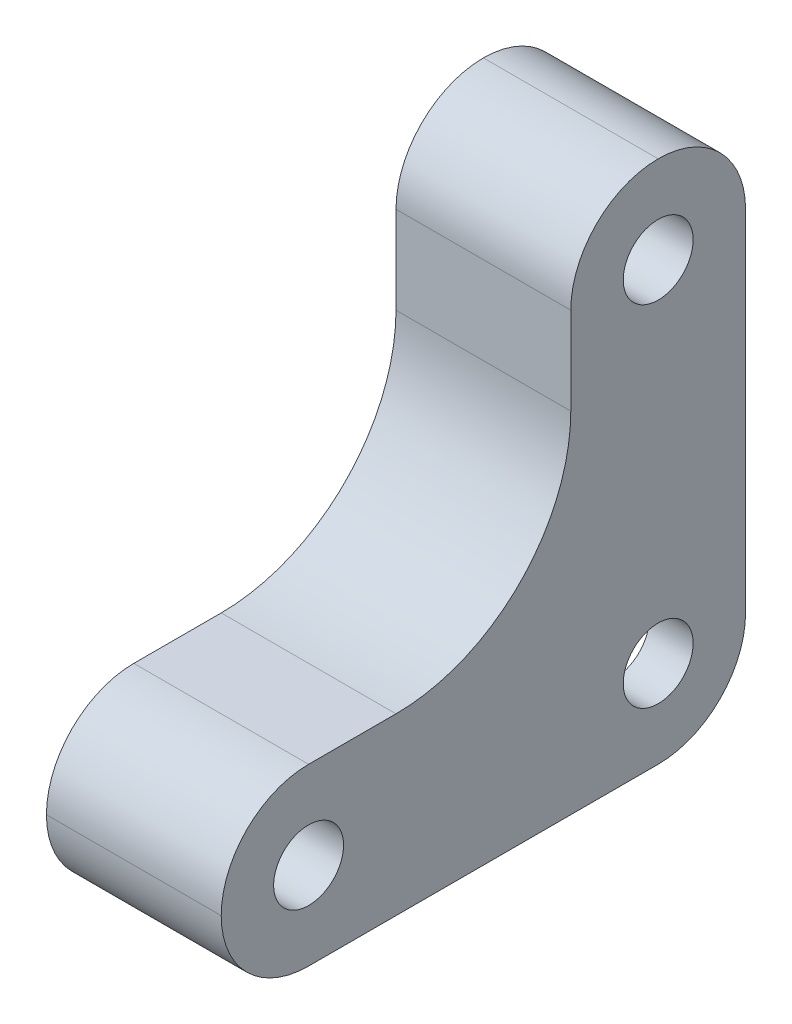
ISO-10303-21;
HEADER;
FILE_DESCRIPTION(('STEP AP214'),'2;1');
FILE_NAME('part.step','',(''),(''),'','','');
FILE_SCHEMA(('AUTOMOTIVE_DESIGN { 1 0 10303 214 1 1 1 1 }'));
ENDSEC;
DATA;
#1=APPLICATION_CONTEXT('core data for automotive mechanical design processes');
#2=APPLICATION_PROTOCOL_DEFINITION('international standard','automotive_design',2000,#1);
#3=PRODUCT_CONTEXT('',#1,'mechanical');
#4=PRODUCT('Part','Part','',(#3));
#5=PRODUCT_RELATED_PRODUCT_CATEGORY('part','',(#4));
#6=PRODUCT_DEFINITION_FORMATION('','',#4);
#7=PRODUCT_DEFINITION_CONTEXT('part definition',#1,'design');
#8=PRODUCT_DEFINITION('design','',#6,#7);
#9=PRODUCT_DEFINITION_SHAPE('','',#8);
#10=(LENGTH_UNIT() NAMED_UNIT(*) SI_UNIT(.MILLI.,.METRE.));
#11=(NAMED_UNIT(*) PLANE_ANGLE_UNIT() SI_UNIT($,.RADIAN.));
#12=(NAMED_UNIT(*) SI_UNIT($,.STERADIAN.) SOLID_ANGLE_UNIT());
#13=UNCERTAINTY_MEASURE_WITH_UNIT(LENGTH_MEASURE(1.E-05),#10,'distance_accuracy_value','');
#14=(GEOMETRIC_REPRESENTATION_CONTEXT(3) GLOBAL_UNCERTAINTY_ASSIGNED_CONTEXT((#13)) GLOBAL_UNIT_ASSIGNED_CONTEXT((#10,
#11,#12)) REPRESENTATION_CONTEXT('',''));
#15=CARTESIAN_POINT('',(0.,0.,0.));
#16=DIRECTION('',(0.,0.,1.));
#17=DIRECTION('',(1.,0.,0.));
#18=AXIS2_PLACEMENT_3D('',#15,#16,#17);
#19=CARTESIAN_POINT('',(0.,10.,0.));
#20=DIRECTION('',(0.,-1.,0.));
#21=DIRECTION('',(0.,0.,-1.));
#22=AXIS2_PLACEMENT_3D('',#19,#20,#21);
#23=PLANE('',#22);
#24=DIRECTION('',(0.,0.,-1.));
#25=VECTOR('',#24,1.);
#26=CARTESIAN_POINT('',(5.,10.,15.));
#27=LINE('',#26,#25);
#28=CARTESIAN_POINT('',(5.,10.,10.));
#29=VERTEX_POINT('',#28);
#30=CARTESIAN_POINT('',(5.,10.,5.));
#31=VERTEX_POINT('',#30);
#32=EDGE_CURVE('E212',#29,#31,#27,.T.);
#33=ORIENTED_EDGE('',*,*,#32,.T.);
#34=DIRECTION('',(1.,0.,0.));
#35=VECTOR('',#34,1.);
#36=CARTESIAN_POINT('',(-5.,10.,5.));
#37=LINE('',#36,#35);
#38=CARTESIAN_POINT('',(-5.,10.,5.));
#39=VERTEX_POINT('',#38);
#40=EDGE_CURVE('E261',#31,#39,#37,.F.);
#41=ORIENTED_EDGE('',*,*,#40,.T.);
#42=DIRECTION('',(0.,0.,1.));
#43=VECTOR('',#42,1.);
#44=CARTESIAN_POINT('',(-5.,10.,15.));
#45=LINE('',#44,#43);
#46=CARTESIAN_POINT('',(-5.,10.,10.));
#47=VERTEX_POINT('',#46);
#48=EDGE_CURVE('E216',#39,#47,#45,.T.);
#49=ORIENTED_EDGE('',*,*,#48,.T.);
#50=DIRECTION('',(1.,0.,0.));
#51=VECTOR('',#50,1.);
#52=CARTESIAN_POINT('',(0.,10.,10.));
#53=LINE('',#52,#51);
#54=EDGE_CURVE('E249',#47,#29,#53,.T.);
#55=ORIENTED_EDGE('',*,*,#54,.T.);
#56=EDGE_LOOP('',(#33,#41,#49,#55));
#57=FACE_BOUND('',#56,.T.);
#58=ADVANCED_FACE('F33',(#57),#23,.F.);
#59=CARTESIAN_POINT('',(5.,10.,15.));
#60=DIRECTION('',(-1.,0.,0.));
#61=DIRECTION('',(0.,0.,1.));
#62=AXIS2_PLACEMENT_3D('',#59,#60,#61);
#63=PLANE('',#62);
#64=CARTESIAN_POINT('',(5.,5.,-10.));
#65=DIRECTION('',(1.,0.,0.));
#66=DIRECTION('',(0.,0.,-1.));
#67=AXIS2_PLACEMENT_3D('',#64,#65,#66);
#68=CIRCLE('',#67,2.);
#69=CARTESIAN_POINT('',(5.,5.,-12.));
#70=VERTEX_POINT('',#69);
#71=EDGE_CURVE('E518',#70,#70,#68,.T.);
#72=ORIENTED_EDGE('',*,*,#71,.F.);
#73=EDGE_LOOP('',(#72));
#74=FACE_BOUND('',#73,.T.);
#75=CARTESIAN_POINT('',(5.,5.,10.));
#76=DIRECTION('',(1.,0.,0.));
#77=DIRECTION('',(0.,0.,-1.));
#78=AXIS2_PLACEMENT_3D('',#75,#76,#77);
#79=CIRCLE('',#78,2.);
#80=CARTESIAN_POINT('',(5.,5.,8.));
#81=VERTEX_POINT('',#80);
#82=EDGE_CURVE('E274',#81,#81,#79,.T.);
#83=ORIENTED_EDGE('',*,*,#82,.F.);
#84=EDGE_LOOP('',(#83));
#85=FACE_BOUND('',#84,.T.);
#86=CARTESIAN_POINT('',(5.,25.,-10.));
#87=DIRECTION('',(1.,0.,0.));
#88=DIRECTION('',(0.,0.,-1.));
#89=AXIS2_PLACEMENT_3D('',#86,#87,#88);
#90=CIRCLE('',#89,2.);
#91=CARTESIAN_POINT('',(5.,25.,-12.));
#92=VERTEX_POINT('',#91);
#93=EDGE_CURVE('E255',#92,#92,#90,.T.);
#94=ORIENTED_EDGE('',*,*,#93,.F.);
#95=EDGE_LOOP('',(#94));
#96=FACE_BOUND('',#95,.T.);
#97=DIRECTION('',(0.,0.,-1.));
#98=VECTOR('',#97,1.);
#99=CARTESIAN_POINT('',(5.,0.,15.));
#100=LINE('',#99,#98);
#101=CARTESIAN_POINT('',(5.,0.,10.));
#102=VERTEX_POINT('',#101);
#103=CARTESIAN_POINT('',(5.,0.,-10.));
#104=VERTEX_POINT('',#103);
#105=EDGE_CURVE('E213',#102,#104,#100,.T.);
#106=ORIENTED_EDGE('',*,*,#105,.T.);
#107=CARTESIAN_POINT('',(5.,5.,-10.));
#108=DIRECTION('',(-1.,0.,0.));
#109=DIRECTION('',(0.,0.,1.));
#110=AXIS2_PLACEMENT_3D('',#107,#108,#109);
#111=CIRCLE('',#110,5.);
#112=CARTESIAN_POINT('',(5.,5.,-15.));
#113=VERTEX_POINT('',#112);
#114=EDGE_CURVE('E11',#104,#113,#111,.F.);
#115=ORIENTED_EDGE('',*,*,#114,.T.);
#116=DIRECTION('',(0.,-1.,0.));
#117=VECTOR('',#116,1.);
#118=CARTESIAN_POINT('',(5.,10.,-15.));
#119=LINE('',#118,#117);
#120=CARTESIAN_POINT('',(5.,25.,-15.));
#121=VERTEX_POINT('',#120);
#122=EDGE_CURVE('E223',#121,#113,#119,.T.);
#123=ORIENTED_EDGE('',*,*,#122,.F.);
#124=CARTESIAN_POINT('',(5.,25.,-10.));
#125=DIRECTION('',(-1.,0.,0.));
#126=DIRECTION('',(0.,0.,1.));
#127=AXIS2_PLACEMENT_3D('',#124,#125,#126);
#128=CIRCLE('',#127,5.);
#129=CARTESIAN_POINT('',(5.,30.,-10.));
#130=VERTEX_POINT('',#129);
#131=EDGE_CURVE('E244',#121,#130,#128,.F.);
#132=ORIENTED_EDGE('',*,*,#131,.T.);
#133=CARTESIAN_POINT('',(5.,25.,-10.));
#134=DIRECTION('',(-1.,0.,0.));
#135=DIRECTION('',(0.,0.,1.));
#136=AXIS2_PLACEMENT_3D('',#133,#134,#135);
#137=CIRCLE('',#136,5.);
#138=CARTESIAN_POINT('',(5.,25.,-5.));
#139=VERTEX_POINT('',#138);
#140=EDGE_CURVE('E242',#130,#139,#137,.F.);
#141=ORIENTED_EDGE('',*,*,#140,.T.);
#142=DIRECTION('',(0.,-1.,0.));
#143=VECTOR('',#142,1.);
#144=CARTESIAN_POINT('',(5.,30.,-5.));
#145=LINE('',#144,#143);
#146=CARTESIAN_POINT('',(5.,20.,-5.));
#147=VERTEX_POINT('',#146);
#148=EDGE_CURVE('E273',#139,#147,#145,.T.);
#149=ORIENTED_EDGE('',*,*,#148,.T.);
#150=CARTESIAN_POINT('',(5.,20.,5.));
#151=DIRECTION('',(-1.,0.,0.));
#152=DIRECTION('',(0.,0.,1.));
#153=AXIS2_PLACEMENT_3D('',#150,#151,#152);
#154=CIRCLE('',#153,10.);
#155=EDGE_CURVE('E263',#147,#31,#154,.T.);
#156=ORIENTED_EDGE('',*,*,#155,.T.);
#157=ORIENTED_EDGE('',*,*,#32,.F.);
#158=CARTESIAN_POINT('',(5.,5.,10.));
#159=DIRECTION('',(-1.,0.,0.));
#160=DIRECTION('',(0.,0.,1.));
#161=AXIS2_PLACEMENT_3D('',#158,#159,#160);
#162=CIRCLE('',#161,5.);
#163=CARTESIAN_POINT('',(5.,5.,15.));
#164=VERTEX_POINT('',#163);
#165=EDGE_CURVE('E238',#29,#164,#162,.F.);
#166=ORIENTED_EDGE('',*,*,#165,.T.);
#167=CARTESIAN_POINT('',(5.,5.,10.));
#168=DIRECTION('',(-1.,0.,0.));
#169=DIRECTION('',(0.,0.,1.));
#170=AXIS2_PLACEMENT_3D('',#167,#168,#169);
#171=CIRCLE('',#170,5.);
#172=EDGE_CURVE('E240',#164,#102,#171,.F.);
#173=ORIENTED_EDGE('',*,*,#172,.T.);
#174=EDGE_LOOP('',(#106,#115,#123,#132,#141,#149,#156,#157,#166,#173));
#175=FACE_BOUND('',#174,.T.);
#176=ADVANCED_FACE('F298',(#74,#85,#96,#175),#63,.F.);
#177=CARTESIAN_POINT('',(-5.,10.,-15.));
#178=DIRECTION('',(0.,0.,1.));
#179=DIRECTION('',(1.,0.,0.));
#180=AXIS2_PLACEMENT_3D('',#177,#178,#179);
#181=PLANE('',#180);
#182=DIRECTION('',(0.,1.,0.));
#183=VECTOR('',#182,1.);
#184=CARTESIAN_POINT('',(-2.5,0.,-15.));
#185=LINE('',#184,#183);
#186=CARTESIAN_POINT('',(-2.5,5.,-15.));
#187=VERTEX_POINT('',#186);
#188=CARTESIAN_POINT('',(-2.5,20.,-15.));
#189=VERTEX_POINT('',#188);
#190=EDGE_CURVE('E147',#187,#189,#185,.T.);
#191=ORIENTED_EDGE('',*,*,#190,.F.);
#192=DIRECTION('',(-1.,0.,0.));
#193=VECTOR('',#192,1.);
#194=CARTESIAN_POINT('',(-5.,5.,-15.));
#195=LINE('',#194,#193);
#196=CARTESIAN_POINT('',(-5.,5.,-15.));
#197=VERTEX_POINT('',#196);
#198=EDGE_CURVE('E181',#187,#197,#195,.T.);
#199=ORIENTED_EDGE('',*,*,#198,.T.);
#200=DIRECTION('',(0.,-1.,0.));
#201=VECTOR('',#200,1.);
#202=CARTESIAN_POINT('',(-5.,10.,-15.));
#203=LINE('',#202,#201);
#204=CARTESIAN_POINT('',(-5.,25.,-15.));
#205=VERTEX_POINT('',#204);
#206=EDGE_CURVE('E207',#205,#197,#203,.T.);
#207=ORIENTED_EDGE('',*,*,#206,.F.);
#208=DIRECTION('',(-1.,0.,0.));
#209=VECTOR('',#208,1.);
#210=CARTESIAN_POINT('',(5.,25.,-15.));
#211=LINE('',#210,#209);
#212=EDGE_CURVE('E235',#205,#121,#211,.F.);
#213=ORIENTED_EDGE('',*,*,#212,.T.);
#214=ORIENTED_EDGE('',*,*,#122,.T.);
#215=DIRECTION('',(-1.,0.,0.));
#216=VECTOR('',#215,1.);
#217=CARTESIAN_POINT('',(2.5,5.,-15.));
#218=LINE('',#217,#216);
#219=CARTESIAN_POINT('',(2.5,5.,-15.));
#220=VERTEX_POINT('',#219);
#221=EDGE_CURVE('E151',#113,#220,#218,.T.);
#222=ORIENTED_EDGE('',*,*,#221,.T.);
#223=DIRECTION('',(0.,-1.,0.));
#224=VECTOR('',#223,1.);
#225=CARTESIAN_POINT('',(2.5,0.,-15.));
#226=LINE('',#225,#224);
#227=CARTESIAN_POINT('',(2.5,20.,-15.));
#228=VERTEX_POINT('',#227);
#229=EDGE_CURVE('E161',#228,#220,#226,.T.);
#230=ORIENTED_EDGE('',*,*,#229,.F.);
#231=DIRECTION('',(-1.,0.,0.));
#232=VECTOR('',#231,1.);
#233=CARTESIAN_POINT('',(-5.,20.,-15.));
#234=LINE('',#233,#232);
#235=EDGE_CURVE('E168',#228,#189,#234,.T.);
#236=ORIENTED_EDGE('',*,*,#235,.T.);
#237=EDGE_LOOP('',(#191,#199,#207,#213,#214,#222,#230,#236));
#238=FACE_BOUND('',#237,.T.);
#239=ADVANCED_FACE('F196',(#238),#181,.F.);
#240=CARTESIAN_POINT('',(-5.,10.,15.));
#241=DIRECTION('',(1.,0.,0.));
#242=DIRECTION('',(0.,0.,-1.));
#243=AXIS2_PLACEMENT_3D('',#240,#241,#242);
#244=PLANE('',#243);
#245=CARTESIAN_POINT('',(-5.,5.,-10.));
#246=DIRECTION('',(1.,0.,0.));
#247=DIRECTION('',(0.,0.,-1.));
#248=AXIS2_PLACEMENT_3D('',#245,#246,#247);
#249=CIRCLE('',#248,2.);
#250=CARTESIAN_POINT('',(-5.,5.,-12.));
#251=VERTEX_POINT('',#250);
#252=EDGE_CURVE('E178',#251,#251,#249,.T.);
#253=ORIENTED_EDGE('',*,*,#252,.T.);
#254=EDGE_LOOP('',(#253));
#255=FACE_BOUND('',#254,.T.);
#256=CARTESIAN_POINT('',(-5.,5.,10.));
#257=DIRECTION('',(1.,0.,0.));
#258=DIRECTION('',(0.,0.,-1.));
#259=AXIS2_PLACEMENT_3D('',#256,#257,#258);
#260=CIRCLE('',#259,2.);
#261=CARTESIAN_POINT('',(-5.,5.,8.));
#262=VERTEX_POINT('',#261);
#263=EDGE_CURVE('E270',#262,#262,#260,.T.);
#264=ORIENTED_EDGE('',*,*,#263,.T.);
#265=EDGE_LOOP('',(#264));
#266=FACE_BOUND('',#265,.T.);
#267=CARTESIAN_POINT('',(-5.,25.,-10.));
#268=DIRECTION('',(1.,0.,0.));
#269=DIRECTION('',(0.,0.,-1.));
#270=AXIS2_PLACEMENT_3D('',#267,#268,#269);
#271=CIRCLE('',#270,2.);
#272=CARTESIAN_POINT('',(-5.,25.,-12.));
#273=VERTEX_POINT('',#272);
#274=EDGE_CURVE('E277',#273,#273,#271,.T.);
#275=ORIENTED_EDGE('',*,*,#274,.T.);
#276=EDGE_LOOP('',(#275));
#277=FACE_BOUND('',#276,.T.);
#278=ORIENTED_EDGE('',*,*,#206,.T.);
#279=CARTESIAN_POINT('',(-5.,5.,-10.));
#280=DIRECTION('',(1.,0.,0.));
#281=DIRECTION('',(0.,0.,-1.));
#282=AXIS2_PLACEMENT_3D('',#279,#280,#281);
#283=CIRCLE('',#282,5.);
#284=CARTESIAN_POINT('',(-5.,0.,-10.));
#285=VERTEX_POINT('',#284);
#286=EDGE_CURVE('E184',#197,#285,#283,.F.);
#287=ORIENTED_EDGE('',*,*,#286,.T.);
#288=DIRECTION('',(0.,0.,1.));
#289=VECTOR('',#288,1.);
#290=CARTESIAN_POINT('',(-5.,0.,15.));
#291=LINE('',#290,#289);
#292=CARTESIAN_POINT('',(-5.,0.,10.));
#293=VERTEX_POINT('',#292);
#294=EDGE_CURVE('E205',#285,#293,#291,.T.);
#295=ORIENTED_EDGE('',*,*,#294,.T.);
#296=CARTESIAN_POINT('',(-5.,5.,10.));
#297=DIRECTION('',(1.,0.,0.));
#298=DIRECTION('',(0.,0.,-1.));
#299=AXIS2_PLACEMENT_3D('',#296,#297,#298);
#300=CIRCLE('',#299,5.);
#301=CARTESIAN_POINT('',(-5.,5.,15.));
#302=VERTEX_POINT('',#301);
#303=EDGE_CURVE('E229',#293,#302,#300,.F.);
#304=ORIENTED_EDGE('',*,*,#303,.T.);
#305=CARTESIAN_POINT('',(-5.,5.,10.));
#306=DIRECTION('',(1.,0.,0.));
#307=DIRECTION('',(0.,0.,-1.));
#308=AXIS2_PLACEMENT_3D('',#305,#306,#307);
#309=CIRCLE('',#308,5.);
#310=EDGE_CURVE('E226',#302,#47,#309,.F.);
#311=ORIENTED_EDGE('',*,*,#310,.T.);
#312=ORIENTED_EDGE('',*,*,#48,.F.);
#313=CARTESIAN_POINT('',(-5.,20.,5.));
#314=DIRECTION('',(1.,0.,0.));
#315=DIRECTION('',(0.,0.,-1.));
#316=AXIS2_PLACEMENT_3D('',#313,#314,#315);
#317=CIRCLE('',#316,10.);
#318=CARTESIAN_POINT('',(-5.,20.,-5.));
#319=VERTEX_POINT('',#318);
#320=EDGE_CURVE('E265',#39,#319,#317,.T.);
#321=ORIENTED_EDGE('',*,*,#320,.T.);
#322=DIRECTION('',(0.,-1.,0.));
#323=VECTOR('',#322,1.);
#324=CARTESIAN_POINT('',(-5.,30.,-5.));
#325=LINE('',#324,#323);
#326=CARTESIAN_POINT('',(-5.,25.,-5.));
#327=VERTEX_POINT('',#326);
#328=EDGE_CURVE('E218',#327,#319,#325,.T.);
#329=ORIENTED_EDGE('',*,*,#328,.F.);
#330=CARTESIAN_POINT('',(-5.,25.,-10.));
#331=DIRECTION('',(1.,0.,0.));
#332=DIRECTION('',(0.,0.,-1.));
#333=AXIS2_PLACEMENT_3D('',#330,#331,#332);
#334=CIRCLE('',#333,5.);
#335=CARTESIAN_POINT('',(-5.,30.,-10.));
#336=VERTEX_POINT('',#335);
#337=EDGE_CURVE('E231',#327,#336,#334,.F.);
#338=ORIENTED_EDGE('',*,*,#337,.T.);
#339=CARTESIAN_POINT('',(-5.,25.,-10.));
#340=DIRECTION('',(1.,0.,0.));
#341=DIRECTION('',(0.,0.,-1.));
#342=AXIS2_PLACEMENT_3D('',#339,#340,#341);
#343=CIRCLE('',#342,5.);
#344=EDGE_CURVE('E233',#336,#205,#343,.F.);
#345=ORIENTED_EDGE('',*,*,#344,.T.);
#346=EDGE_LOOP('',(#278,#287,#295,#304,#311,#312,#321,#329,#338,#345));
#347=FACE_BOUND('',#346,.T.);
#348=ADVANCED_FACE('F204',(#255,#266,#277,#347),#244,.F.);
#349=CARTESIAN_POINT('',(0.,0.,0.));
#350=DIRECTION('',(0.,-1.,0.));
#351=DIRECTION('',(0.,0.,-1.));
#352=AXIS2_PLACEMENT_3D('',#349,#350,#351);
#353=PLANE('',#352);
#354=ORIENTED_EDGE('',*,*,#294,.F.);
#355=DIRECTION('',(-1.,0.,0.));
#356=VECTOR('',#355,1.);
#357=CARTESIAN_POINT('',(-2.5,0.,-10.));
#358=LINE('',#357,#356);
#359=CARTESIAN_POINT('',(-2.5,0.,-10.));
#360=VERTEX_POINT('',#359);
#361=EDGE_CURVE('E187',#285,#360,#358,.F.);
#362=ORIENTED_EDGE('',*,*,#361,.T.);
#363=DIRECTION('',(0.,0.,-1.));
#364=VECTOR('',#363,1.);
#365=CARTESIAN_POINT('',(-2.5,0.,-5.));
#366=LINE('',#365,#364);
#367=CARTESIAN_POINT('',(-2.5,0.,5.00000000000004));
#368=VERTEX_POINT('',#367);
#369=EDGE_CURVE('E191',#368,#360,#366,.T.);
#370=ORIENTED_EDGE('',*,*,#369,.F.);
#371=DIRECTION('',(1.,0.,0.));
#372=VECTOR('',#371,1.);
#373=CARTESIAN_POINT('',(2.5,0.,5.00000000000004));
#374=LINE('',#373,#372);
#375=CARTESIAN_POINT('',(2.5,0.,5.00000000000004));
#376=VERTEX_POINT('',#375);
#377=EDGE_CURVE('E166',#368,#376,#374,.T.);
#378=ORIENTED_EDGE('',*,*,#377,.T.);
#379=DIRECTION('',(0.,0.,-1.));
#380=VECTOR('',#379,1.);
#381=CARTESIAN_POINT('',(2.5,0.,-5.));
#382=LINE('',#381,#380);
#383=CARTESIAN_POINT('',(2.5,0.,-10.));
#384=VERTEX_POINT('',#383);
#385=EDGE_CURVE('E199',#376,#384,#382,.T.);
#386=ORIENTED_EDGE('',*,*,#385,.T.);
#387=DIRECTION('',(-1.,0.,0.));
#388=VECTOR('',#387,1.);
#389=CARTESIAN_POINT('',(5.,0.,-10.));
#390=LINE('',#389,#388);
#391=EDGE_CURVE('E48',#384,#104,#390,.F.);
#392=ORIENTED_EDGE('',*,*,#391,.T.);
#393=ORIENTED_EDGE('',*,*,#105,.F.);
#394=DIRECTION('',(1.,0.,0.));
#395=VECTOR('',#394,1.);
#396=CARTESIAN_POINT('',(-5.,0.,10.));
#397=LINE('',#396,#395);
#398=EDGE_CURVE('E211',#102,#293,#397,.F.);
#399=ORIENTED_EDGE('',*,*,#398,.T.);
#400=EDGE_LOOP('',(#354,#362,#370,#378,#386,#392,#393,#399));
#401=FACE_BOUND('',#400,.T.);
#402=ADVANCED_FACE('F209',(#401),#353,.T.);
#403=CARTESIAN_POINT('',(-5.,30.,-5.));
#404=DIRECTION('',(0.,0.,-1.));
#405=DIRECTION('',(-1.,0.,0.));
#406=AXIS2_PLACEMENT_3D('',#403,#404,#405);
#407=PLANE('',#406);
#408=ORIENTED_EDGE('',*,*,#328,.T.);
#409=DIRECTION('',(1.,0.,0.));
#410=VECTOR('',#409,1.);
#411=CARTESIAN_POINT('',(5.,20.,-5.));
#412=LINE('',#411,#410);
#413=EDGE_CURVE('E251',#319,#147,#412,.T.);
#414=ORIENTED_EDGE('',*,*,#413,.T.);
#415=ORIENTED_EDGE('',*,*,#148,.F.);
#416=DIRECTION('',(1.,0.,0.));
#417=VECTOR('',#416,1.);
#418=CARTESIAN_POINT('',(-5.,25.,-5.));
#419=LINE('',#418,#417);
#420=EDGE_CURVE('E246',#139,#327,#419,.F.);
#421=ORIENTED_EDGE('',*,*,#420,.T.);
#422=EDGE_LOOP('',(#408,#414,#415,#421));
#423=FACE_BOUND('',#422,.T.);
#424=ADVANCED_FACE('F305',(#423),#407,.F.);
#425=CARTESIAN_POINT('',(-5.,25.,-10.));
#426=DIRECTION('',(1.,0.,0.));
#427=DIRECTION('',(0.,0.,-1.));
#428=AXIS2_PLACEMENT_3D('',#425,#426,#427);
#429=CYLINDRICAL_SURFACE('',#428,2.);
#430=ORIENTED_EDGE('',*,*,#274,.F.);
#431=EDGE_LOOP('',(#430));
#432=FACE_BOUND('',#431,.T.);
#433=ORIENTED_EDGE('',*,*,#93,.T.);
#434=EDGE_LOOP('',(#433));
#435=FACE_BOUND('',#434,.T.);
#436=ADVANCED_FACE('F373',(#432,#435),#429,.F.);
#437=CARTESIAN_POINT('',(-5.,5.,10.));
#438=DIRECTION('',(1.,0.,0.));
#439=DIRECTION('',(0.,0.,-1.));
#440=AXIS2_PLACEMENT_3D('',#437,#438,#439);
#441=CYLINDRICAL_SURFACE('',#440,2.);
#442=ORIENTED_EDGE('',*,*,#263,.F.);
#443=EDGE_LOOP('',(#442));
#444=FACE_BOUND('',#443,.T.);
#445=ORIENTED_EDGE('',*,*,#82,.T.);
#446=EDGE_LOOP('',(#445));
#447=FACE_BOUND('',#446,.T.);
#448=ADVANCED_FACE('F346',(#444,#447),#441,.F.);
#449=CARTESIAN_POINT('',(0.,25.,-10.));
#450=DIRECTION('',(-1.,0.,0.));
#451=DIRECTION('',(0.,0.,1.));
#452=AXIS2_PLACEMENT_3D('',#449,#450,#451);
#453=CYLINDRICAL_SURFACE('',#452,5.);
#454=ORIENTED_EDGE('',*,*,#420,.F.);
#455=ORIENTED_EDGE('',*,*,#140,.F.);
#456=DIRECTION('',(1.,0.,0.));
#457=VECTOR('',#456,1.);
#458=CARTESIAN_POINT('',(5.,30.,-10.));
#459=LINE('',#458,#457);
#460=EDGE_CURVE('E252',#336,#130,#459,.T.);
#461=ORIENTED_EDGE('',*,*,#460,.F.);
#462=ORIENTED_EDGE('',*,*,#337,.F.);
#463=EDGE_LOOP('',(#454,#455,#461,#462));
#464=FACE_BOUND('',#463,.T.);
#465=ADVANCED_FACE('F310',(#464),#453,.T.);
#466=CARTESIAN_POINT('',(0.,25.,-10.));
#467=DIRECTION('',(1.,0.,0.));
#468=DIRECTION('',(0.,0.,-1.));
#469=AXIS2_PLACEMENT_3D('',#466,#467,#468);
#470=CYLINDRICAL_SURFACE('',#469,5.);
#471=ORIENTED_EDGE('',*,*,#131,.F.);
#472=ORIENTED_EDGE('',*,*,#212,.F.);
#473=ORIENTED_EDGE('',*,*,#344,.F.);
#474=ORIENTED_EDGE('',*,*,#460,.T.);
#475=EDGE_LOOP('',(#471,#472,#473,#474));
#476=FACE_BOUND('',#475,.T.);
#477=ADVANCED_FACE('F316',(#476),#470,.T.);
#478=CARTESIAN_POINT('',(0.,5.,10.));
#479=DIRECTION('',(1.,0.,0.));
#480=DIRECTION('',(0.,0.,-1.));
#481=AXIS2_PLACEMENT_3D('',#478,#479,#480);
#482=CYLINDRICAL_SURFACE('',#481,5.);
#483=ORIENTED_EDGE('',*,*,#54,.F.);
#484=ORIENTED_EDGE('',*,*,#310,.F.);
#485=DIRECTION('',(1.,0.,0.));
#486=VECTOR('',#485,1.);
#487=CARTESIAN_POINT('',(-5.,5.,15.));
#488=LINE('',#487,#486);
#489=EDGE_CURVE('E256',#164,#302,#488,.F.);
#490=ORIENTED_EDGE('',*,*,#489,.F.);
#491=ORIENTED_EDGE('',*,*,#165,.F.);
#492=EDGE_LOOP('',(#483,#484,#490,#491));
#493=FACE_BOUND('',#492,.T.);
#494=ADVANCED_FACE('F295',(#493),#482,.T.);
#495=CARTESIAN_POINT('',(-5.,5.,10.));
#496=DIRECTION('',(-1.,0.,0.));
#497=DIRECTION('',(0.,0.,1.));
#498=AXIS2_PLACEMENT_3D('',#495,#496,#497);
#499=CYLINDRICAL_SURFACE('',#498,5.);
#500=ORIENTED_EDGE('',*,*,#303,.F.);
#501=ORIENTED_EDGE('',*,*,#398,.F.);
#502=ORIENTED_EDGE('',*,*,#172,.F.);
#503=ORIENTED_EDGE('',*,*,#489,.T.);
#504=EDGE_LOOP('',(#500,#501,#502,#503));
#505=FACE_BOUND('',#504,.T.);
#506=ADVANCED_FACE('F347',(#505),#499,.T.);
#507=CARTESIAN_POINT('',(-5.,20.,5.));
#508=DIRECTION('',(-1.,0.,0.));
#509=DIRECTION('',(0.,0.,1.));
#510=AXIS2_PLACEMENT_3D('',#507,#508,#509);
#511=CYLINDRICAL_SURFACE('',#510,10.);
#512=ORIENTED_EDGE('',*,*,#320,.F.);
#513=ORIENTED_EDGE('',*,*,#40,.F.);
#514=ORIENTED_EDGE('',*,*,#155,.F.);
#515=ORIENTED_EDGE('',*,*,#413,.F.);
#516=EDGE_LOOP('',(#512,#513,#514,#515));
#517=FACE_BOUND('',#516,.T.);
#518=ADVANCED_FACE('F300',(#517),#511,.F.);
#519=CARTESIAN_POINT('',(2.5,0.,-5.));
#520=DIRECTION('',(1.,0.,0.));
#521=DIRECTION('',(0.,0.,-1.));
#522=AXIS2_PLACEMENT_3D('',#519,#520,#521);
#523=PLANE('',#522);
#524=CARTESIAN_POINT('',(2.5,5.,-10.));
#525=DIRECTION('',(1.,0.,0.));
#526=DIRECTION('',(0.,0.,-1.));
#527=AXIS2_PLACEMENT_3D('',#524,#525,#526);
#528=CIRCLE('',#527,2.);
#529=CARTESIAN_POINT('',(2.5,5.,-12.));
#530=VERTEX_POINT('',#529);
#531=EDGE_CURVE('E162',#530,#530,#528,.T.);
#532=ORIENTED_EDGE('',*,*,#531,.T.);
#533=EDGE_LOOP('',(#532));
#534=FACE_BOUND('',#533,.T.);
#535=ORIENTED_EDGE('',*,*,#229,.T.);
#536=CARTESIAN_POINT('',(2.5,5.,-10.));
#537=DIRECTION('',(1.,0.,0.));
#538=DIRECTION('',(0.,0.,-1.));
#539=AXIS2_PLACEMENT_3D('',#536,#537,#538);
#540=CIRCLE('',#539,5.);
#541=EDGE_CURVE('E41',#220,#384,#540,.F.);
#542=ORIENTED_EDGE('',*,*,#541,.T.);
#543=ORIENTED_EDGE('',*,*,#385,.F.);
#544=DIRECTION('',(0.,0.707106781186546,-0.707106781186549));
#545=VECTOR('',#544,1.);
#546=CARTESIAN_POINT('',(2.5,5.00000000000002,0.));
#547=LINE('',#546,#545);
#548=CARTESIAN_POINT('',(2.5,10.,-5.));
#549=VERTEX_POINT('',#548);
#550=EDGE_CURVE('E167',#376,#549,#547,.T.);
#551=ORIENTED_EDGE('',*,*,#550,.T.);
#552=DIRECTION('',(0.,-0.707106781186549,0.707106781186546));
#553=VECTOR('',#552,1.);
#554=CARTESIAN_POINT('',(2.5,4.99999999999998,0.));
#555=LINE('',#554,#553);
#556=EDGE_CURVE('E152',#549,#228,#555,.F.);
#557=ORIENTED_EDGE('',*,*,#556,.T.);
#558=EDGE_LOOP('',(#535,#542,#543,#551,#557));
#559=FACE_BOUND('',#558,.T.);
#560=ADVANCED_FACE('F355',(#534,#559),#523,.F.);
#561=CARTESIAN_POINT('',(-2.5,0.,-5.));
#562=DIRECTION('',(-1.,0.,0.));
#563=DIRECTION('',(0.,0.,1.));
#564=AXIS2_PLACEMENT_3D('',#561,#562,#563);
#565=PLANE('',#564);
#566=CARTESIAN_POINT('',(-2.5,5.,-10.));
#567=DIRECTION('',(-1.,0.,0.));
#568=DIRECTION('',(0.,0.,1.));
#569=AXIS2_PLACEMENT_3D('',#566,#567,#568);
#570=CIRCLE('',#569,2.);
#571=CARTESIAN_POINT('',(-2.5,5.,-8.00000000000001));
#572=VERTEX_POINT('',#571);
#573=EDGE_CURVE('E175',#572,#572,#570,.T.);
#574=ORIENTED_EDGE('',*,*,#573,.T.);
#575=EDGE_LOOP('',(#574));
#576=FACE_BOUND('',#575,.T.);
#577=ORIENTED_EDGE('',*,*,#369,.T.);
#578=CARTESIAN_POINT('',(-2.5,5.,-10.));
#579=DIRECTION('',(-1.,0.,0.));
#580=DIRECTION('',(0.,0.,1.));
#581=AXIS2_PLACEMENT_3D('',#578,#579,#580);
#582=CIRCLE('',#581,5.);
#583=EDGE_CURVE('E189',#360,#187,#582,.F.);
#584=ORIENTED_EDGE('',*,*,#583,.T.);
#585=ORIENTED_EDGE('',*,*,#190,.T.);
#586=DIRECTION('',(0.,0.707106781186549,-0.707106781186546));
#587=VECTOR('',#586,1.);
#588=CARTESIAN_POINT('',(-2.5,4.99999999999998,0.));
#589=LINE('',#588,#587);
#590=CARTESIAN_POINT('',(-2.5,10.,-5.));
#591=VERTEX_POINT('',#590);
#592=EDGE_CURVE('E139',#189,#591,#589,.F.);
#593=ORIENTED_EDGE('',*,*,#592,.T.);
#594=DIRECTION('',(0.,-0.707106781186546,0.707106781186549));
#595=VECTOR('',#594,1.);
#596=CARTESIAN_POINT('',(-2.5,5.00000000000002,0.));
#597=LINE('',#596,#595);
#598=EDGE_CURVE('E144',#591,#368,#597,.T.);
#599=ORIENTED_EDGE('',*,*,#598,.T.);
#600=EDGE_LOOP('',(#577,#584,#585,#593,#599));
#601=FACE_BOUND('',#600,.T.);
#602=ADVANCED_FACE('F142',(#576,#601),#565,.F.);
#603=CARTESIAN_POINT('',(2.5,10.,-5.00000000000001));
#604=DIRECTION('',(0.,0.707106781186546,0.707106781186549));
#605=DIRECTION('',(1.,0.,0.));
#606=AXIS2_PLACEMENT_3D('',#603,#604,#605);
#607=PLANE('',#606);
#608=ORIENTED_EDGE('',*,*,#235,.F.);
#609=ORIENTED_EDGE('',*,*,#556,.F.);
#610=DIRECTION('',(1.,0.,0.));
#611=VECTOR('',#610,1.);
#612=CARTESIAN_POINT('',(2.5,10.,-5.00000000000001));
#613=LINE('',#612,#611);
#614=EDGE_CURVE('E156',#591,#549,#613,.T.);
#615=ORIENTED_EDGE('',*,*,#614,.F.);
#616=ORIENTED_EDGE('',*,*,#592,.F.);
#617=EDGE_LOOP('',(#608,#609,#615,#616));
#618=FACE_BOUND('',#617,.T.);
#619=ADVANCED_FACE('F157',(#618),#607,.F.);
#620=CARTESIAN_POINT('',(0.,10.,-5.));
#621=DIRECTION('',(0.,-0.707106781186549,-0.707106781186546));
#622=DIRECTION('',(1.,0.,0.));
#623=AXIS2_PLACEMENT_3D('',#620,#621,#622);
#624=PLANE('',#623);
#625=ORIENTED_EDGE('',*,*,#550,.F.);
#626=ORIENTED_EDGE('',*,*,#377,.F.);
#627=ORIENTED_EDGE('',*,*,#598,.F.);
#628=ORIENTED_EDGE('',*,*,#614,.T.);
#629=EDGE_LOOP('',(#625,#626,#627,#628));
#630=FACE_BOUND('',#629,.T.);
#631=ADVANCED_FACE('F164',(#630),#624,.T.);
#632=CARTESIAN_POINT('',(-5.,5.,-10.));
#633=DIRECTION('',(1.,0.,0.));
#634=DIRECTION('',(0.,0.,-1.));
#635=AXIS2_PLACEMENT_3D('',#632,#633,#634);
#636=CYLINDRICAL_SURFACE('',#635,2.);
#637=ORIENTED_EDGE('',*,*,#252,.F.);
#638=EDGE_LOOP('',(#637));
#639=FACE_BOUND('',#638,.T.);
#640=ORIENTED_EDGE('',*,*,#573,.F.);
#641=EDGE_LOOP('',(#640));
#642=FACE_BOUND('',#641,.T.);
#643=ADVANCED_FACE('F358',(#639,#642),#636,.F.);
#644=ORIENTED_EDGE('',*,*,#71,.T.);
#645=EDGE_LOOP('',(#644));
#646=FACE_BOUND('',#645,.T.);
#647=ORIENTED_EDGE('',*,*,#531,.F.);
#648=EDGE_LOOP('',(#647));
#649=FACE_BOUND('',#648,.T.);
#650=ADVANCED_FACE('F324',(#646,#649),#636,.F.);
#651=CARTESIAN_POINT('',(-5.,5.,-10.));
#652=DIRECTION('',(1.,0.,0.));
#653=DIRECTION('',(0.,0.,-1.));
#654=AXIS2_PLACEMENT_3D('',#651,#652,#653);
#655=CYLINDRICAL_SURFACE('',#654,5.);
#656=ORIENTED_EDGE('',*,*,#583,.F.);
#657=ORIENTED_EDGE('',*,*,#361,.F.);
#658=ORIENTED_EDGE('',*,*,#286,.F.);
#659=ORIENTED_EDGE('',*,*,#198,.F.);
#660=EDGE_LOOP('',(#656,#657,#658,#659));
#661=FACE_BOUND('',#660,.T.);
#662=ADVANCED_FACE('F201',(#661),#655,.T.);
#663=CARTESIAN_POINT('',(-5.,5.,-10.));
#664=DIRECTION('',(1.,0.,0.));
#665=DIRECTION('',(0.,0.,-1.));
#666=AXIS2_PLACEMENT_3D('',#663,#664,#665);
#667=CYLINDRICAL_SURFACE('',#666,5.);
#668=ORIENTED_EDGE('',*,*,#114,.F.);
#669=ORIENTED_EDGE('',*,*,#391,.F.);
#670=ORIENTED_EDGE('',*,*,#541,.F.);
#671=ORIENTED_EDGE('',*,*,#221,.F.);
#672=EDGE_LOOP('',(#668,#669,#670,#671));
#673=FACE_BOUND('',#672,.T.);
#674=ADVANCED_FACE('F35',(#673),#667,.T.);
#675=CLOSED_SHELL('',(#58,#176,#239,#348,#402,#424,#436,#448,#465,#477,#494,#506,#518,#560,#602,
#619,#631,#643,#650,#662,#674));
#676=MANIFOLD_SOLID_BREP('B2',#675);
#677=ADVANCED_BREP_SHAPE_REPRESENTATION('',(#18,#676),#14);
#678=SHAPE_DEFINITION_REPRESENTATION(#9,#677);
ENDSEC;
END-ISO-10303-21;
